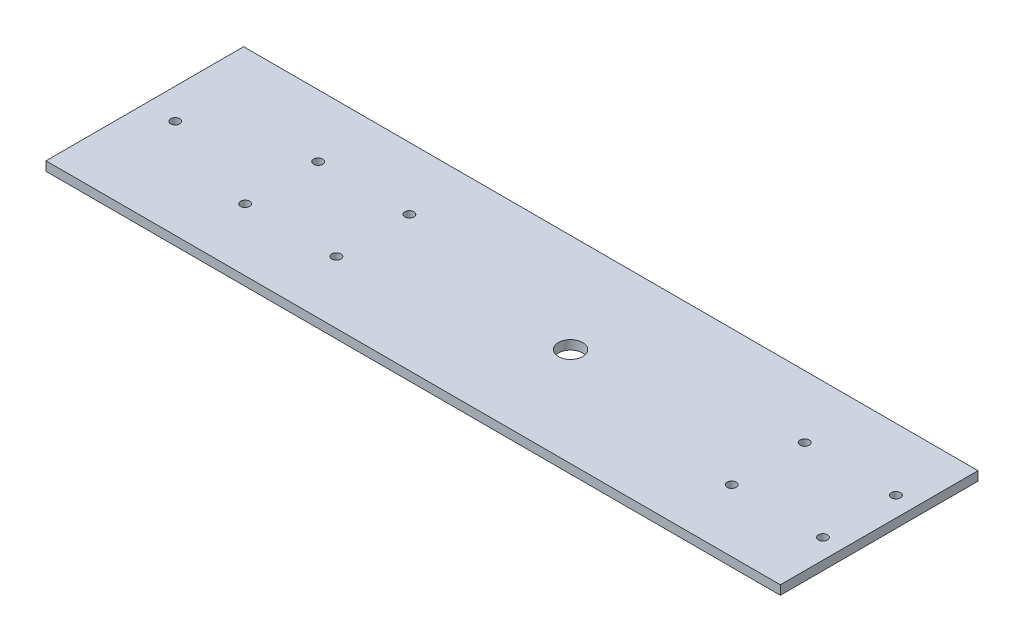
ISO-10303-21;
HEADER;
FILE_DESCRIPTION(('STEP AP214'),'2;1');
FILE_NAME('part.step','',(''),(''),'','','');
FILE_SCHEMA(('AUTOMOTIVE_DESIGN { 1 0 10303 214 1 1 1 1 }'));
ENDSEC;
DATA;
#1=APPLICATION_CONTEXT('core data for automotive mechanical design processes');
#2=APPLICATION_PROTOCOL_DEFINITION('international standard','automotive_design',2000,#1);
#3=PRODUCT_CONTEXT('',#1,'mechanical');
#4=PRODUCT('Part','Part','',(#3));
#5=PRODUCT_RELATED_PRODUCT_CATEGORY('part','',(#4));
#6=PRODUCT_DEFINITION_FORMATION('','',#4);
#7=PRODUCT_DEFINITION_CONTEXT('part definition',#1,'design');
#8=PRODUCT_DEFINITION('design','',#6,#7);
#9=PRODUCT_DEFINITION_SHAPE('','',#8);
#10=(LENGTH_UNIT() NAMED_UNIT(*) SI_UNIT(.MILLI.,.METRE.));
#11=(NAMED_UNIT(*) PLANE_ANGLE_UNIT() SI_UNIT($,.RADIAN.));
#12=(NAMED_UNIT(*) SI_UNIT($,.STERADIAN.) SOLID_ANGLE_UNIT());
#13=UNCERTAINTY_MEASURE_WITH_UNIT(LENGTH_MEASURE(1.E-05),#10,'distance_accuracy_value','');
#14=(GEOMETRIC_REPRESENTATION_CONTEXT(3) GLOBAL_UNCERTAINTY_ASSIGNED_CONTEXT((#13)) GLOBAL_UNIT_ASSIGNED_CONTEXT((#10,
#11,#12)) REPRESENTATION_CONTEXT('',''));
#15=CARTESIAN_POINT('',(0.,0.,0.));
#16=DIRECTION('',(0.,0.,1.));
#17=DIRECTION('',(1.,0.,0.));
#18=AXIS2_PLACEMENT_3D('',#15,#16,#17);
#19=CARTESIAN_POINT('',(101.5,1.5,32.5));
#20=DIRECTION('',(-1.,0.,0.));
#21=DIRECTION('',(0.,0.,1.));
#22=AXIS2_PLACEMENT_3D('',#19,#20,#21);
#23=PLANE('',#22);
#24=DIRECTION('',(0.,0.,-1.));
#25=VECTOR('',#24,1.);
#26=CARTESIAN_POINT('',(101.5,-1.5,32.5));
#27=LINE('',#26,#25);
#28=CARTESIAN_POINT('',(101.5,-1.5,32.5));
#29=VERTEX_POINT('',#28);
#30=CARTESIAN_POINT('',(101.5,-1.5,-32.5));
#31=VERTEX_POINT('',#30);
#32=EDGE_CURVE('E106',#29,#31,#27,.T.);
#33=ORIENTED_EDGE('',*,*,#32,.T.);
#34=DIRECTION('',(0.,-1.,0.));
#35=VECTOR('',#34,1.);
#36=CARTESIAN_POINT('',(101.5,1.5,-32.5));
#37=LINE('',#36,#35);
#38=CARTESIAN_POINT('',(101.5,1.5,-32.5));
#39=VERTEX_POINT('',#38);
#40=EDGE_CURVE('E11',#39,#31,#37,.T.);
#41=ORIENTED_EDGE('',*,*,#40,.F.);
#42=DIRECTION('',(0.,0.,-1.));
#43=VECTOR('',#42,1.);
#44=CARTESIAN_POINT('',(101.5,1.5,32.5));
#45=LINE('',#44,#43);
#46=CARTESIAN_POINT('',(101.5,1.5,32.5));
#47=VERTEX_POINT('',#46);
#48=EDGE_CURVE('E90',#47,#39,#45,.T.);
#49=ORIENTED_EDGE('',*,*,#48,.F.);
#50=DIRECTION('',(0.,-1.,0.));
#51=VECTOR('',#50,1.);
#52=CARTESIAN_POINT('',(101.5,1.5,32.5));
#53=LINE('',#52,#51);
#54=EDGE_CURVE('E102',#47,#29,#53,.T.);
#55=ORIENTED_EDGE('',*,*,#54,.T.);
#56=EDGE_LOOP('',(#33,#41,#49,#55));
#57=FACE_BOUND('',#56,.T.);
#58=ADVANCED_FACE('F38',(#57),#23,.F.);
#59=CARTESIAN_POINT('',(-140.,1.5,-32.5));
#60=DIRECTION('',(0.,0.,1.));
#61=DIRECTION('',(1.,0.,0.));
#62=AXIS2_PLACEMENT_3D('',#59,#60,#61);
#63=PLANE('',#62);
#64=DIRECTION('',(-1.,0.,0.));
#65=VECTOR('',#64,1.);
#66=CARTESIAN_POINT('',(-140.,-1.5,-32.5));
#67=LINE('',#66,#65);
#68=CARTESIAN_POINT('',(-140.,-1.5,-32.5));
#69=VERTEX_POINT('',#68);
#70=EDGE_CURVE('E95',#31,#69,#67,.T.);
#71=ORIENTED_EDGE('',*,*,#70,.T.);
#72=DIRECTION('',(0.,-1.,0.));
#73=VECTOR('',#72,1.);
#74=CARTESIAN_POINT('',(-140.,1.5,-32.5));
#75=LINE('',#74,#73);
#76=CARTESIAN_POINT('',(-140.,1.5,-32.5));
#77=VERTEX_POINT('',#76);
#78=EDGE_CURVE('E47',#77,#69,#75,.T.);
#79=ORIENTED_EDGE('',*,*,#78,.F.);
#80=DIRECTION('',(-1.,0.,0.));
#81=VECTOR('',#80,1.);
#82=CARTESIAN_POINT('',(-140.,1.5,-32.5));
#83=LINE('',#82,#81);
#84=EDGE_CURVE('E85',#39,#77,#83,.T.);
#85=ORIENTED_EDGE('',*,*,#84,.F.);
#86=ORIENTED_EDGE('',*,*,#40,.T.);
#87=EDGE_LOOP('',(#71,#79,#85,#86));
#88=FACE_BOUND('',#87,.T.);
#89=ADVANCED_FACE('F94',(#88),#63,.F.);
#90=CARTESIAN_POINT('',(-140.,1.5,32.5));
#91=DIRECTION('',(1.,0.,0.));
#92=DIRECTION('',(0.,0.,-1.));
#93=AXIS2_PLACEMENT_3D('',#90,#91,#92);
#94=PLANE('',#93);
#95=DIRECTION('',(0.,0.,1.));
#96=VECTOR('',#95,1.);
#97=CARTESIAN_POINT('',(-140.,-1.5,32.5));
#98=LINE('',#97,#96);
#99=CARTESIAN_POINT('',(-140.,-1.5,32.5));
#100=VERTEX_POINT('',#99);
#101=EDGE_CURVE('E72',#69,#100,#98,.T.);
#102=ORIENTED_EDGE('',*,*,#101,.T.);
#103=DIRECTION('',(0.,-1.,0.));
#104=VECTOR('',#103,1.);
#105=CARTESIAN_POINT('',(-140.,1.5,32.5));
#106=LINE('',#105,#104);
#107=CARTESIAN_POINT('',(-140.,1.5,32.5));
#108=VERTEX_POINT('',#107);
#109=EDGE_CURVE('E97',#108,#100,#106,.T.);
#110=ORIENTED_EDGE('',*,*,#109,.F.);
#111=DIRECTION('',(0.,0.,1.));
#112=VECTOR('',#111,1.);
#113=CARTESIAN_POINT('',(-140.,1.5,32.5));
#114=LINE('',#113,#112);
#115=EDGE_CURVE('E88',#77,#108,#114,.T.);
#116=ORIENTED_EDGE('',*,*,#115,.F.);
#117=ORIENTED_EDGE('',*,*,#78,.T.);
#118=EDGE_LOOP('',(#102,#110,#116,#117));
#119=FACE_BOUND('',#118,.T.);
#120=ADVANCED_FACE('F98',(#119),#94,.F.);
#121=CARTESIAN_POINT('',(-140.,1.5,32.5));
#122=DIRECTION('',(0.,0.,-1.));
#123=DIRECTION('',(-1.,0.,0.));
#124=AXIS2_PLACEMENT_3D('',#121,#122,#123);
#125=PLANE('',#124);
#126=DIRECTION('',(1.,0.,0.));
#127=VECTOR('',#126,1.);
#128=CARTESIAN_POINT('',(-140.,-1.5,32.5));
#129=LINE('',#128,#127);
#130=EDGE_CURVE('E78',#100,#29,#129,.T.);
#131=ORIENTED_EDGE('',*,*,#130,.T.);
#132=ORIENTED_EDGE('',*,*,#54,.F.);
#133=DIRECTION('',(1.,0.,0.));
#134=VECTOR('',#133,1.);
#135=CARTESIAN_POINT('',(-140.,1.5,32.5));
#136=LINE('',#135,#134);
#137=EDGE_CURVE('E55',#108,#47,#136,.T.);
#138=ORIENTED_EDGE('',*,*,#137,.F.);
#139=ORIENTED_EDGE('',*,*,#109,.T.);
#140=EDGE_LOOP('',(#131,#132,#138,#139));
#141=FACE_BOUND('',#140,.T.);
#142=ADVANCED_FACE('F120',(#141),#125,.F.);
#143=CARTESIAN_POINT('',(0.,1.5,0.));
#144=DIRECTION('',(0.,-1.,0.));
#145=DIRECTION('',(0.,0.,-1.));
#146=AXIS2_PLACEMENT_3D('',#143,#144,#145);
#147=PLANE('',#146);
#148=CARTESIAN_POINT('',(-130.,1.5,0.));
#149=DIRECTION('',(0.,-1.,0.));
#150=DIRECTION('',(0.,0.,-1.));
#151=AXIS2_PLACEMENT_3D('',#148,#149,#150);
#152=CIRCLE('',#151,1.5);
#153=CARTESIAN_POINT('',(-130.,1.5,-1.5));
#154=VERTEX_POINT('',#153);
#155=EDGE_CURVE('E192',#154,#154,#152,.T.);
#156=ORIENTED_EDGE('',*,*,#155,.T.);
#157=EDGE_LOOP('',(#156));
#158=FACE_BOUND('',#157,.T.);
#159=CARTESIAN_POINT('',(-65.,1.5,12.));
#160=DIRECTION('',(0.,-1.,0.));
#161=DIRECTION('',(0.,0.,-1.));
#162=AXIS2_PLACEMENT_3D('',#159,#160,#161);
#163=CIRCLE('',#162,1.5);
#164=CARTESIAN_POINT('',(-65.,1.5,10.5));
#165=VERTEX_POINT('',#164);
#166=EDGE_CURVE('E160',#165,#165,#163,.F.);
#167=ORIENTED_EDGE('',*,*,#166,.F.);
#168=EDGE_LOOP('',(#167));
#169=FACE_BOUND('',#168,.T.);
#170=CARTESIAN_POINT('',(-95.,1.5,12.));
#171=DIRECTION('',(0.,-1.,0.));
#172=DIRECTION('',(0.,0.,-1.));
#173=AXIS2_PLACEMENT_3D('',#170,#171,#172);
#174=CIRCLE('',#173,1.5);
#175=CARTESIAN_POINT('',(-95.,1.5,10.5));
#176=VERTEX_POINT('',#175);
#177=EDGE_CURVE('E170',#176,#176,#174,.F.);
#178=ORIENTED_EDGE('',*,*,#177,.F.);
#179=EDGE_LOOP('',(#178));
#180=FACE_BOUND('',#179,.T.);
#181=CARTESIAN_POINT('',(-95.,1.5,-12.));
#182=DIRECTION('',(0.,-1.,0.));
#183=DIRECTION('',(0.,0.,-1.));
#184=AXIS2_PLACEMENT_3D('',#181,#182,#183);
#185=CIRCLE('',#184,1.5);
#186=CARTESIAN_POINT('',(-95.,1.5,-13.5));
#187=VERTEX_POINT('',#186);
#188=EDGE_CURVE('E174',#187,#187,#185,.F.);
#189=ORIENTED_EDGE('',*,*,#188,.F.);
#190=EDGE_LOOP('',(#189));
#191=FACE_BOUND('',#190,.T.);
#192=CARTESIAN_POINT('',(-65.,1.5,-12.));
#193=DIRECTION('',(0.,-1.,0.));
#194=DIRECTION('',(0.,0.,-1.));
#195=AXIS2_PLACEMENT_3D('',#192,#193,#194);
#196=CIRCLE('',#195,1.5);
#197=CARTESIAN_POINT('',(-65.,1.5,-13.5));
#198=VERTEX_POINT('',#197);
#199=EDGE_CURVE('E178',#198,#198,#196,.F.);
#200=ORIENTED_EDGE('',*,*,#199,.F.);
#201=EDGE_LOOP('',(#200));
#202=FACE_BOUND('',#201,.T.);
#203=CARTESIAN_POINT('',(65.,1.5,12.));
#204=DIRECTION('',(0.,-1.,0.));
#205=DIRECTION('',(0.,0.,-1.));
#206=AXIS2_PLACEMENT_3D('',#203,#204,#205);
#207=CIRCLE('',#206,1.5);
#208=CARTESIAN_POINT('',(65.,1.5,10.5));
#209=VERTEX_POINT('',#208);
#210=EDGE_CURVE('E131',#209,#209,#207,.T.);
#211=ORIENTED_EDGE('',*,*,#210,.T.);
#212=EDGE_LOOP('',(#211));
#213=FACE_BOUND('',#212,.T.);
#214=CARTESIAN_POINT('',(95.,1.5,12.));
#215=DIRECTION('',(0.,-1.,0.));
#216=DIRECTION('',(0.,0.,-1.));
#217=AXIS2_PLACEMENT_3D('',#214,#215,#216);
#218=CIRCLE('',#217,1.5);
#219=CARTESIAN_POINT('',(95.,1.5,10.5));
#220=VERTEX_POINT('',#219);
#221=EDGE_CURVE('E138',#220,#220,#218,.T.);
#222=ORIENTED_EDGE('',*,*,#221,.T.);
#223=EDGE_LOOP('',(#222));
#224=FACE_BOUND('',#223,.T.);
#225=CARTESIAN_POINT('',(95.,1.5,-12.));
#226=DIRECTION('',(0.,-1.,0.));
#227=DIRECTION('',(0.,0.,-1.));
#228=AXIS2_PLACEMENT_3D('',#225,#226,#227);
#229=CIRCLE('',#228,1.5);
#230=CARTESIAN_POINT('',(95.,1.5,-13.5));
#231=VERTEX_POINT('',#230);
#232=EDGE_CURVE('E142',#231,#231,#229,.T.);
#233=ORIENTED_EDGE('',*,*,#232,.T.);
#234=EDGE_LOOP('',(#233));
#235=FACE_BOUND('',#234,.T.);
#236=CARTESIAN_POINT('',(65.,1.5,-12.));
#237=DIRECTION('',(0.,-1.,0.));
#238=DIRECTION('',(0.,0.,-1.));
#239=AXIS2_PLACEMENT_3D('',#236,#237,#238);
#240=CIRCLE('',#239,1.5);
#241=CARTESIAN_POINT('',(65.,1.5,-13.5));
#242=VERTEX_POINT('',#241);
#243=EDGE_CURVE('E146',#242,#242,#240,.T.);
#244=ORIENTED_EDGE('',*,*,#243,.T.);
#245=EDGE_LOOP('',(#244));
#246=FACE_BOUND('',#245,.T.);
#247=CARTESIAN_POINT('',(0.,1.5,0.));
#248=DIRECTION('',(0.,1.,0.));
#249=DIRECTION('',(0.,0.,1.));
#250=AXIS2_PLACEMENT_3D('',#247,#248,#249);
#251=CIRCLE('',#250,4.);
#252=CARTESIAN_POINT('',(0.,1.5,4.));
#253=VERTEX_POINT('',#252);
#254=EDGE_CURVE('E127',#253,#253,#251,.T.);
#255=ORIENTED_EDGE('',*,*,#254,.F.);
#256=EDGE_LOOP('',(#255));
#257=FACE_BOUND('',#256,.T.);
#258=ORIENTED_EDGE('',*,*,#48,.T.);
#259=ORIENTED_EDGE('',*,*,#84,.T.);
#260=ORIENTED_EDGE('',*,*,#115,.T.);
#261=ORIENTED_EDGE('',*,*,#137,.T.);
#262=EDGE_LOOP('',(#258,#259,#260,#261));
#263=FACE_BOUND('',#262,.T.);
#264=ADVANCED_FACE('F86',(#158,#169,#180,#191,#202,#213,#224,#235,#246,#257,#263),#147,.F.);
#265=CARTESIAN_POINT('',(0.,-1.5,0.));
#266=DIRECTION('',(0.,-1.,0.));
#267=DIRECTION('',(0.,0.,-1.));
#268=AXIS2_PLACEMENT_3D('',#265,#266,#267);
#269=PLANE('',#268);
#270=CARTESIAN_POINT('',(-130.,-1.5,0.));
#271=DIRECTION('',(0.,1.,0.));
#272=DIRECTION('',(0.,0.,1.));
#273=AXIS2_PLACEMENT_3D('',#270,#271,#272);
#274=CIRCLE('',#273,1.5);
#275=CARTESIAN_POINT('',(-130.,-1.5,1.5));
#276=VERTEX_POINT('',#275);
#277=EDGE_CURVE('E202',#276,#276,#274,.T.);
#278=ORIENTED_EDGE('',*,*,#277,.T.);
#279=EDGE_LOOP('',(#278));
#280=FACE_BOUND('',#279,.T.);
#281=CARTESIAN_POINT('',(-65.,-1.5,12.));
#282=DIRECTION('',(0.,-1.,0.));
#283=DIRECTION('',(0.,0.,-1.));
#284=AXIS2_PLACEMENT_3D('',#281,#282,#283);
#285=CIRCLE('',#284,1.5);
#286=CARTESIAN_POINT('',(-65.,-1.5,10.5));
#287=VERTEX_POINT('',#286);
#288=EDGE_CURVE('E187',#287,#287,#285,.T.);
#289=ORIENTED_EDGE('',*,*,#288,.F.);
#290=EDGE_LOOP('',(#289));
#291=FACE_BOUND('',#290,.T.);
#292=CARTESIAN_POINT('',(-95.,-1.5,12.));
#293=DIRECTION('',(0.,-1.,0.));
#294=DIRECTION('',(0.,0.,-1.));
#295=AXIS2_PLACEMENT_3D('',#292,#293,#294);
#296=CIRCLE('',#295,1.5);
#297=CARTESIAN_POINT('',(-95.,-1.5,10.5));
#298=VERTEX_POINT('',#297);
#299=EDGE_CURVE('E191',#298,#298,#296,.T.);
#300=ORIENTED_EDGE('',*,*,#299,.F.);
#301=EDGE_LOOP('',(#300));
#302=FACE_BOUND('',#301,.T.);
#303=CARTESIAN_POINT('',(-95.,-1.5,-12.));
#304=DIRECTION('',(0.,-1.,0.));
#305=DIRECTION('',(0.,0.,1.));
#306=AXIS2_PLACEMENT_3D('',#303,#304,#305);
#307=CIRCLE('',#306,1.5);
#308=CARTESIAN_POINT('',(-95.,-1.5,-10.5));
#309=VERTEX_POINT('',#308);
#310=EDGE_CURVE('E186',#309,#309,#307,.T.);
#311=ORIENTED_EDGE('',*,*,#310,.F.);
#312=EDGE_LOOP('',(#311));
#313=FACE_BOUND('',#312,.T.);
#314=CARTESIAN_POINT('',(-65.,-1.5,-12.));
#315=DIRECTION('',(0.,-1.,0.));
#316=DIRECTION('',(0.,0.,1.));
#317=AXIS2_PLACEMENT_3D('',#314,#315,#316);
#318=CIRCLE('',#317,1.5);
#319=CARTESIAN_POINT('',(-65.,-1.5,-10.5));
#320=VERTEX_POINT('',#319);
#321=EDGE_CURVE('E182',#320,#320,#318,.T.);
#322=ORIENTED_EDGE('',*,*,#321,.F.);
#323=EDGE_LOOP('',(#322));
#324=FACE_BOUND('',#323,.T.);
#325=CARTESIAN_POINT('',(65.,-1.5,12.));
#326=DIRECTION('',(0.,1.,0.));
#327=DIRECTION('',(0.,0.,-1.));
#328=AXIS2_PLACEMENT_3D('',#325,#326,#327);
#329=CIRCLE('',#328,1.5);
#330=CARTESIAN_POINT('',(65.,-1.5,10.5));
#331=VERTEX_POINT('',#330);
#332=EDGE_CURVE('E155',#331,#331,#329,.T.);
#333=ORIENTED_EDGE('',*,*,#332,.T.);
#334=EDGE_LOOP('',(#333));
#335=FACE_BOUND('',#334,.T.);
#336=CARTESIAN_POINT('',(95.,-1.5,12.));
#337=DIRECTION('',(0.,1.,0.));
#338=DIRECTION('',(0.,0.,-1.));
#339=AXIS2_PLACEMENT_3D('',#336,#337,#338);
#340=CIRCLE('',#339,1.5);
#341=CARTESIAN_POINT('',(95.,-1.5,10.5));
#342=VERTEX_POINT('',#341);
#343=EDGE_CURVE('E159',#342,#342,#340,.T.);
#344=ORIENTED_EDGE('',*,*,#343,.T.);
#345=EDGE_LOOP('',(#344));
#346=FACE_BOUND('',#345,.T.);
#347=CARTESIAN_POINT('',(95.,-1.5,-12.));
#348=DIRECTION('',(0.,1.,0.));
#349=DIRECTION('',(0.,0.,1.));
#350=AXIS2_PLACEMENT_3D('',#347,#348,#349);
#351=CIRCLE('',#350,1.5);
#352=CARTESIAN_POINT('',(95.,-1.5,-10.5));
#353=VERTEX_POINT('',#352);
#354=EDGE_CURVE('E154',#353,#353,#351,.T.);
#355=ORIENTED_EDGE('',*,*,#354,.T.);
#356=EDGE_LOOP('',(#355));
#357=FACE_BOUND('',#356,.T.);
#358=CARTESIAN_POINT('',(65.,-1.5,-12.));
#359=DIRECTION('',(0.,1.,0.));
#360=DIRECTION('',(0.,0.,1.));
#361=AXIS2_PLACEMENT_3D('',#358,#359,#360);
#362=CIRCLE('',#361,1.5);
#363=CARTESIAN_POINT('',(65.,-1.5,-10.5));
#364=VERTEX_POINT('',#363);
#365=EDGE_CURVE('E150',#364,#364,#362,.T.);
#366=ORIENTED_EDGE('',*,*,#365,.T.);
#367=EDGE_LOOP('',(#366));
#368=FACE_BOUND('',#367,.T.);
#369=CARTESIAN_POINT('',(0.,-1.5,0.));
#370=DIRECTION('',(0.,1.,0.));
#371=DIRECTION('',(0.,0.,1.));
#372=AXIS2_PLACEMENT_3D('',#369,#370,#371);
#373=CIRCLE('',#372,4.);
#374=CARTESIAN_POINT('',(0.,-1.5,4.));
#375=VERTEX_POINT('',#374);
#376=EDGE_CURVE('E110',#375,#375,#373,.T.);
#377=ORIENTED_EDGE('',*,*,#376,.T.);
#378=EDGE_LOOP('',(#377));
#379=FACE_BOUND('',#378,.T.);
#380=ORIENTED_EDGE('',*,*,#32,.F.);
#381=ORIENTED_EDGE('',*,*,#130,.F.);
#382=ORIENTED_EDGE('',*,*,#101,.F.);
#383=ORIENTED_EDGE('',*,*,#70,.F.);
#384=EDGE_LOOP('',(#380,#381,#382,#383));
#385=FACE_BOUND('',#384,.T.);
#386=ADVANCED_FACE('F123',(#280,#291,#302,#313,#324,#335,#346,#357,#368,#379,#385),#269,.T.);
#387=CARTESIAN_POINT('',(0.,-1.5,0.));
#388=DIRECTION('',(0.,1.,0.));
#389=DIRECTION('',(0.,0.,1.));
#390=AXIS2_PLACEMENT_3D('',#387,#388,#389);
#391=CYLINDRICAL_SURFACE('',#390,4.);
#392=ORIENTED_EDGE('',*,*,#376,.F.);
#393=EDGE_LOOP('',(#392));
#394=FACE_BOUND('',#393,.T.);
#395=ORIENTED_EDGE('',*,*,#254,.T.);
#396=EDGE_LOOP('',(#395));
#397=FACE_BOUND('',#396,.T.);
#398=ADVANCED_FACE('F237',(#394,#397),#391,.F.);
#399=CARTESIAN_POINT('',(65.,-1.5,-12.));
#400=DIRECTION('',(0.,1.,0.));
#401=DIRECTION('',(0.,0.,1.));
#402=AXIS2_PLACEMENT_3D('',#399,#400,#401);
#403=CYLINDRICAL_SURFACE('',#402,1.5);
#404=ORIENTED_EDGE('',*,*,#365,.F.);
#405=EDGE_LOOP('',(#404));
#406=FACE_BOUND('',#405,.T.);
#407=ORIENTED_EDGE('',*,*,#243,.F.);
#408=EDGE_LOOP('',(#407));
#409=FACE_BOUND('',#408,.T.);
#410=ADVANCED_FACE('F239',(#406,#409),#403,.F.);
#411=CARTESIAN_POINT('',(95.,-1.5,-12.));
#412=DIRECTION('',(0.,1.,0.));
#413=DIRECTION('',(0.,0.,1.));
#414=AXIS2_PLACEMENT_3D('',#411,#412,#413);
#415=CYLINDRICAL_SURFACE('',#414,1.5);
#416=ORIENTED_EDGE('',*,*,#354,.F.);
#417=EDGE_LOOP('',(#416));
#418=FACE_BOUND('',#417,.T.);
#419=ORIENTED_EDGE('',*,*,#232,.F.);
#420=EDGE_LOOP('',(#419));
#421=FACE_BOUND('',#420,.T.);
#422=ADVANCED_FACE('F246',(#418,#421),#415,.F.);
#423=CARTESIAN_POINT('',(95.,-1.5,12.));
#424=DIRECTION('',(0.,1.,0.));
#425=DIRECTION('',(0.,0.,1.));
#426=AXIS2_PLACEMENT_3D('',#423,#424,#425);
#427=CYLINDRICAL_SURFACE('',#426,1.5);
#428=ORIENTED_EDGE('',*,*,#343,.F.);
#429=EDGE_LOOP('',(#428));
#430=FACE_BOUND('',#429,.T.);
#431=ORIENTED_EDGE('',*,*,#221,.F.);
#432=EDGE_LOOP('',(#431));
#433=FACE_BOUND('',#432,.T.);
#434=ADVANCED_FACE('F322',(#430,#433),#427,.F.);
#435=CARTESIAN_POINT('',(65.,-1.5,12.));
#436=DIRECTION('',(0.,1.,0.));
#437=DIRECTION('',(0.,0.,1.));
#438=AXIS2_PLACEMENT_3D('',#435,#436,#437);
#439=CYLINDRICAL_SURFACE('',#438,1.5);
#440=ORIENTED_EDGE('',*,*,#332,.F.);
#441=EDGE_LOOP('',(#440));
#442=FACE_BOUND('',#441,.T.);
#443=ORIENTED_EDGE('',*,*,#210,.F.);
#444=EDGE_LOOP('',(#443));
#445=FACE_BOUND('',#444,.T.);
#446=ADVANCED_FACE('F314',(#442,#445),#439,.F.);
#447=CARTESIAN_POINT('',(-65.,-1.5,-12.));
#448=DIRECTION('',(0.,1.,0.));
#449=DIRECTION('',(0.,0.,1.));
#450=AXIS2_PLACEMENT_3D('',#447,#448,#449);
#451=CYLINDRICAL_SURFACE('',#450,1.5);
#452=ORIENTED_EDGE('',*,*,#321,.T.);
#453=EDGE_LOOP('',(#452));
#454=FACE_BOUND('',#453,.T.);
#455=ORIENTED_EDGE('',*,*,#199,.T.);
#456=EDGE_LOOP('',(#455));
#457=FACE_BOUND('',#456,.T.);
#458=ADVANCED_FACE('F306',(#454,#457),#451,.F.);
#459=CARTESIAN_POINT('',(-95.,-1.5,-12.));
#460=DIRECTION('',(0.,1.,0.));
#461=DIRECTION('',(0.,0.,1.));
#462=AXIS2_PLACEMENT_3D('',#459,#460,#461);
#463=CYLINDRICAL_SURFACE('',#462,1.5);
#464=ORIENTED_EDGE('',*,*,#310,.T.);
#465=EDGE_LOOP('',(#464));
#466=FACE_BOUND('',#465,.T.);
#467=ORIENTED_EDGE('',*,*,#188,.T.);
#468=EDGE_LOOP('',(#467));
#469=FACE_BOUND('',#468,.T.);
#470=ADVANCED_FACE('F298',(#466,#469),#463,.F.);
#471=CARTESIAN_POINT('',(-95.,-1.5,12.));
#472=DIRECTION('',(0.,1.,0.));
#473=DIRECTION('',(0.,0.,1.));
#474=AXIS2_PLACEMENT_3D('',#471,#472,#473);
#475=CYLINDRICAL_SURFACE('',#474,1.5);
#476=ORIENTED_EDGE('',*,*,#299,.T.);
#477=EDGE_LOOP('',(#476));
#478=FACE_BOUND('',#477,.T.);
#479=ORIENTED_EDGE('',*,*,#177,.T.);
#480=EDGE_LOOP('',(#479));
#481=FACE_BOUND('',#480,.T.);
#482=ADVANCED_FACE('F291',(#478,#481),#475,.F.);
#483=CARTESIAN_POINT('',(-65.,-1.5,12.));
#484=DIRECTION('',(0.,1.,0.));
#485=DIRECTION('',(0.,0.,1.));
#486=AXIS2_PLACEMENT_3D('',#483,#484,#485);
#487=CYLINDRICAL_SURFACE('',#486,1.5);
#488=ORIENTED_EDGE('',*,*,#288,.T.);
#489=EDGE_LOOP('',(#488));
#490=FACE_BOUND('',#489,.T.);
#491=ORIENTED_EDGE('',*,*,#166,.T.);
#492=EDGE_LOOP('',(#491));
#493=FACE_BOUND('',#492,.T.);
#494=ADVANCED_FACE('F212',(#490,#493),#487,.F.);
#495=CARTESIAN_POINT('',(-130.,-1.5,0.));
#496=DIRECTION('',(0.,1.,0.));
#497=DIRECTION('',(0.,0.,1.));
#498=AXIS2_PLACEMENT_3D('',#495,#496,#497);
#499=CYLINDRICAL_SURFACE('',#498,1.5);
#500=ORIENTED_EDGE('',*,*,#277,.F.);
#501=EDGE_LOOP('',(#500));
#502=FACE_BOUND('',#501,.T.);
#503=ORIENTED_EDGE('',*,*,#155,.F.);
#504=EDGE_LOOP('',(#503));
#505=FACE_BOUND('',#504,.T.);
#506=ADVANCED_FACE('F209',(#502,#505),#499,.F.);
#507=CLOSED_SHELL('',(#58,#89,#120,#142,#264,#386,#398,#410,#422,#434,#446,#458,#470,#482,#494,#506));
#508=MANIFOLD_SOLID_BREP('B2',#507);
#509=ADVANCED_BREP_SHAPE_REPRESENTATION('',(#18,#508),#14);
#510=SHAPE_DEFINITION_REPRESENTATION(#9,#509);
ENDSEC;
END-ISO-10303-21;
